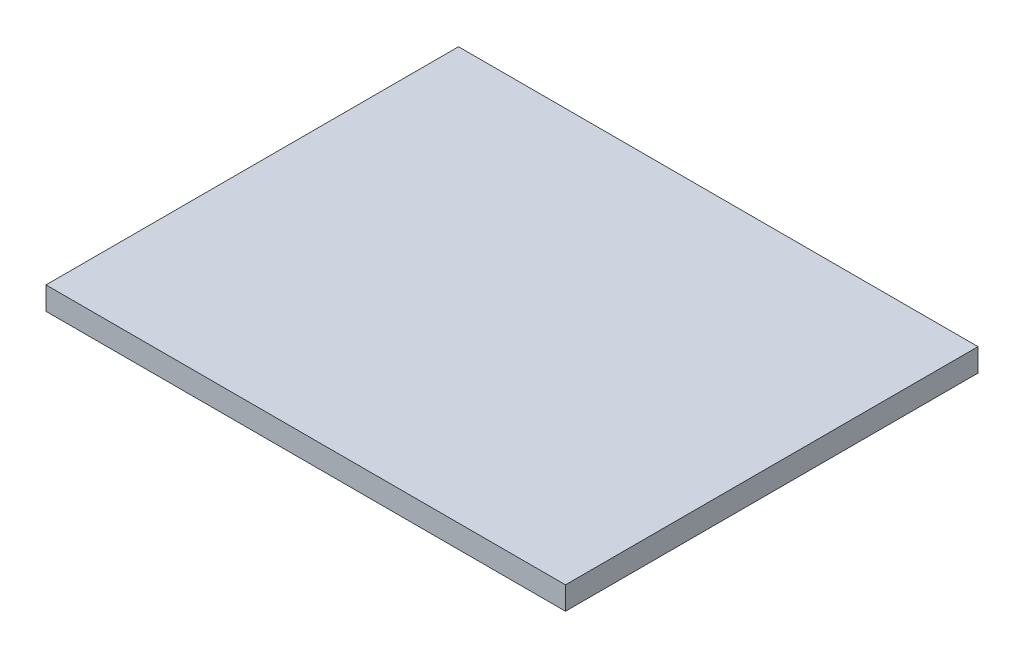
ISO-10303-21;
HEADER;
FILE_DESCRIPTION(('STEP AP214'),'2;1');
FILE_NAME('part.step','',(''),(''),'','','');
FILE_SCHEMA(('AUTOMOTIVE_DESIGN { 1 0 10303 214 1 1 1 1 }'));
ENDSEC;
DATA;
#1=APPLICATION_CONTEXT('core data for automotive mechanical design processes');
#2=APPLICATION_PROTOCOL_DEFINITION('international standard','automotive_design',2000,#1);
#3=PRODUCT_CONTEXT('',#1,'mechanical');
#4=PRODUCT('Part','Part','',(#3));
#5=PRODUCT_RELATED_PRODUCT_CATEGORY('part','',(#4));
#6=PRODUCT_DEFINITION_FORMATION('','',#4);
#7=PRODUCT_DEFINITION_CONTEXT('part definition',#1,'design');
#8=PRODUCT_DEFINITION('design','',#6,#7);
#9=PRODUCT_DEFINITION_SHAPE('','',#8);
#10=(LENGTH_UNIT() NAMED_UNIT(*) SI_UNIT(.MILLI.,.METRE.));
#11=(NAMED_UNIT(*) PLANE_ANGLE_UNIT() SI_UNIT($,.RADIAN.));
#12=(NAMED_UNIT(*) SI_UNIT($,.STERADIAN.) SOLID_ANGLE_UNIT());
#13=UNCERTAINTY_MEASURE_WITH_UNIT(LENGTH_MEASURE(1.E-05),#10,'distance_accuracy_value','');
#14=(GEOMETRIC_REPRESENTATION_CONTEXT(3) GLOBAL_UNCERTAINTY_ASSIGNED_CONTEXT((#13)) GLOBAL_UNIT_ASSIGNED_CONTEXT((#10,
#11,#12)) REPRESENTATION_CONTEXT('',''));
#15=CARTESIAN_POINT('',(0.,0.,0.));
#16=DIRECTION('',(0.,0.,1.));
#17=DIRECTION('',(1.,0.,0.));
#18=AXIS2_PLACEMENT_3D('',#15,#16,#17);
#19=CARTESIAN_POINT('',(34.,3.,0.));
#20=DIRECTION('',(-1.,0.,0.));
#21=DIRECTION('',(0.,0.,1.));
#22=AXIS2_PLACEMENT_3D('',#19,#20,#21);
#23=PLANE('',#22);
#24=DIRECTION('',(0.,0.,-1.));
#25=VECTOR('',#24,1.);
#26=CARTESIAN_POINT('',(34.,0.,0.));
#27=LINE('',#26,#25);
#28=CARTESIAN_POINT('',(34.,0.,27.));
#29=VERTEX_POINT('',#28);
#30=CARTESIAN_POINT('',(34.,0.,-27.));
#31=VERTEX_POINT('',#30);
#32=EDGE_CURVE('E102',#29,#31,#27,.T.);
#33=ORIENTED_EDGE('',*,*,#32,.T.);
#34=DIRECTION('',(0.,-1.,0.));
#35=VECTOR('',#34,1.);
#36=CARTESIAN_POINT('',(34.,3.,-27.));
#37=LINE('',#36,#35);
#38=CARTESIAN_POINT('',(34.,3.,-27.));
#39=VERTEX_POINT('',#38);
#40=EDGE_CURVE('E11',#39,#31,#37,.T.);
#41=ORIENTED_EDGE('',*,*,#40,.F.);
#42=DIRECTION('',(0.,0.,-1.));
#43=VECTOR('',#42,1.);
#44=CARTESIAN_POINT('',(34.,3.,0.));
#45=LINE('',#44,#43);
#46=CARTESIAN_POINT('',(34.,3.,27.));
#47=VERTEX_POINT('',#46);
#48=EDGE_CURVE('E88',#47,#39,#45,.T.);
#49=ORIENTED_EDGE('',*,*,#48,.F.);
#50=DIRECTION('',(0.,-1.,0.));
#51=VECTOR('',#50,1.);
#52=CARTESIAN_POINT('',(34.,3.,27.));
#53=LINE('',#52,#51);
#54=EDGE_CURVE('E55',#47,#29,#53,.T.);
#55=ORIENTED_EDGE('',*,*,#54,.T.);
#56=EDGE_LOOP('',(#33,#41,#49,#55));
#57=FACE_BOUND('',#56,.T.);
#58=ADVANCED_FACE('F39',(#57),#23,.F.);
#59=CARTESIAN_POINT('',(0.,3.,-27.));
#60=DIRECTION('',(0.,0.,1.));
#61=DIRECTION('',(1.,0.,0.));
#62=AXIS2_PLACEMENT_3D('',#59,#60,#61);
#63=PLANE('',#62);
#64=DIRECTION('',(-1.,0.,0.));
#65=VECTOR('',#64,1.);
#66=CARTESIAN_POINT('',(0.,0.,-27.));
#67=LINE('',#66,#65);
#68=CARTESIAN_POINT('',(-34.,0.,-27.));
#69=VERTEX_POINT('',#68);
#70=EDGE_CURVE('E93',#31,#69,#67,.T.);
#71=ORIENTED_EDGE('',*,*,#70,.T.);
#72=DIRECTION('',(0.,-1.,0.));
#73=VECTOR('',#72,1.);
#74=CARTESIAN_POINT('',(-34.,3.,-27.));
#75=LINE('',#74,#73);
#76=CARTESIAN_POINT('',(-34.,3.,-27.));
#77=VERTEX_POINT('',#76);
#78=EDGE_CURVE('E47',#77,#69,#75,.T.);
#79=ORIENTED_EDGE('',*,*,#78,.F.);
#80=DIRECTION('',(-1.,0.,0.));
#81=VECTOR('',#80,1.);
#82=CARTESIAN_POINT('',(0.,3.,-27.));
#83=LINE('',#82,#81);
#84=EDGE_CURVE('E80',#39,#77,#83,.T.);
#85=ORIENTED_EDGE('',*,*,#84,.F.);
#86=ORIENTED_EDGE('',*,*,#40,.T.);
#87=EDGE_LOOP('',(#71,#79,#85,#86));
#88=FACE_BOUND('',#87,.T.);
#89=ADVANCED_FACE('F92',(#88),#63,.F.);
#90=CARTESIAN_POINT('',(-34.,3.,0.));
#91=DIRECTION('',(-1.,0.,0.));
#92=DIRECTION('',(0.,0.,1.));
#93=AXIS2_PLACEMENT_3D('',#90,#91,#92);
#94=PLANE('',#93);
#95=DIRECTION('',(0.,0.,-1.));
#96=VECTOR('',#95,1.);
#97=CARTESIAN_POINT('',(-34.,0.,0.));
#98=LINE('',#97,#96);
#99=CARTESIAN_POINT('',(-34.,0.,27.));
#100=VERTEX_POINT('',#99);
#101=EDGE_CURVE('E105',#100,#69,#98,.T.);
#102=ORIENTED_EDGE('',*,*,#101,.F.);
#103=DIRECTION('',(0.,-1.,0.));
#104=VECTOR('',#103,1.);
#105=CARTESIAN_POINT('',(-34.,3.,27.));
#106=LINE('',#105,#104);
#107=CARTESIAN_POINT('',(-34.,3.,27.));
#108=VERTEX_POINT('',#107);
#109=EDGE_CURVE('E69',#108,#100,#106,.T.);
#110=ORIENTED_EDGE('',*,*,#109,.F.);
#111=DIRECTION('',(0.,0.,-1.));
#112=VECTOR('',#111,1.);
#113=CARTESIAN_POINT('',(-34.,3.,0.));
#114=LINE('',#113,#112);
#115=EDGE_CURVE('E87',#108,#77,#114,.T.);
#116=ORIENTED_EDGE('',*,*,#115,.T.);
#117=ORIENTED_EDGE('',*,*,#78,.T.);
#118=EDGE_LOOP('',(#102,#110,#116,#117));
#119=FACE_BOUND('',#118,.T.);
#120=ADVANCED_FACE('F96',(#119),#94,.T.);
#121=CARTESIAN_POINT('',(0.,3.,27.));
#122=DIRECTION('',(0.,0.,1.));
#123=DIRECTION('',(1.,0.,0.));
#124=AXIS2_PLACEMENT_3D('',#121,#122,#123);
#125=PLANE('',#124);
#126=DIRECTION('',(-1.,0.,0.));
#127=VECTOR('',#126,1.);
#128=CARTESIAN_POINT('',(0.,0.,27.));
#129=LINE('',#128,#127);
#130=EDGE_CURVE('E107',#29,#100,#129,.T.);
#131=ORIENTED_EDGE('',*,*,#130,.F.);
#132=ORIENTED_EDGE('',*,*,#54,.F.);
#133=DIRECTION('',(-1.,0.,0.));
#134=VECTOR('',#133,1.);
#135=CARTESIAN_POINT('',(0.,3.,27.));
#136=LINE('',#135,#134);
#137=EDGE_CURVE('E97',#47,#108,#136,.T.);
#138=ORIENTED_EDGE('',*,*,#137,.T.);
#139=ORIENTED_EDGE('',*,*,#109,.T.);
#140=EDGE_LOOP('',(#131,#132,#138,#139));
#141=FACE_BOUND('',#140,.T.);
#142=ADVANCED_FACE('F113',(#141),#125,.T.);
#143=CARTESIAN_POINT('',(0.,3.,0.));
#144=DIRECTION('',(0.,1.,0.));
#145=DIRECTION('',(0.,0.,1.));
#146=AXIS2_PLACEMENT_3D('',#143,#144,#145);
#147=PLANE('',#146);
#148=ORIENTED_EDGE('',*,*,#48,.T.);
#149=ORIENTED_EDGE('',*,*,#84,.T.);
#150=ORIENTED_EDGE('',*,*,#115,.F.);
#151=ORIENTED_EDGE('',*,*,#137,.F.);
#152=EDGE_LOOP('',(#148,#149,#150,#151));
#153=FACE_BOUND('',#152,.T.);
#154=ADVANCED_FACE('F84',(#153),#147,.T.);
#155=CARTESIAN_POINT('',(0.,0.,0.));
#156=DIRECTION('',(0.,1.,0.));
#157=DIRECTION('',(0.,0.,1.));
#158=AXIS2_PLACEMENT_3D('',#155,#156,#157);
#159=PLANE('',#158);
#160=ORIENTED_EDGE('',*,*,#32,.F.);
#161=ORIENTED_EDGE('',*,*,#130,.T.);
#162=ORIENTED_EDGE('',*,*,#101,.T.);
#163=ORIENTED_EDGE('',*,*,#70,.F.);
#164=EDGE_LOOP('',(#160,#161,#162,#163));
#165=FACE_BOUND('',#164,.T.);
#166=ADVANCED_FACE('F112',(#165),#159,.F.);
#167=CLOSED_SHELL('',(#58,#89,#120,#142,#154,#166));
#168=MANIFOLD_SOLID_BREP('B2',#167);
#169=ADVANCED_BREP_SHAPE_REPRESENTATION('',(#18,#168),#14);
#170=SHAPE_DEFINITION_REPRESENTATION(#9,#169);
ENDSEC;
END-ISO-10303-21;
